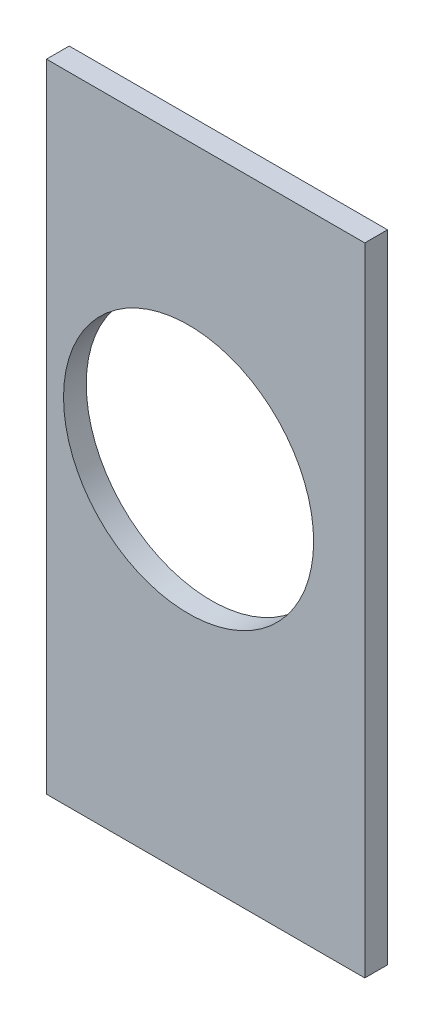
ISO-10303-21;
HEADER;
FILE_DESCRIPTION(('STEP AP214'),'2;1');
FILE_NAME('part.step','',(''),(''),'','','');
FILE_SCHEMA(('AUTOMOTIVE_DESIGN { 1 0 10303 214 1 1 1 1 }'));
ENDSEC;
DATA;
#1=APPLICATION_CONTEXT('core data for automotive mechanical design processes');
#2=APPLICATION_PROTOCOL_DEFINITION('international standard','automotive_design',2000,#1);
#3=PRODUCT_CONTEXT('',#1,'mechanical');
#4=PRODUCT('Part','Part','',(#3));
#5=PRODUCT_RELATED_PRODUCT_CATEGORY('part','',(#4));
#6=PRODUCT_DEFINITION_FORMATION('','',#4);
#7=PRODUCT_DEFINITION_CONTEXT('part definition',#1,'design');
#8=PRODUCT_DEFINITION('design','',#6,#7);
#9=PRODUCT_DEFINITION_SHAPE('','',#8);
#10=(LENGTH_UNIT() NAMED_UNIT(*) SI_UNIT(.MILLI.,.METRE.));
#11=(NAMED_UNIT(*) PLANE_ANGLE_UNIT() SI_UNIT($,.RADIAN.));
#12=(NAMED_UNIT(*) SI_UNIT($,.STERADIAN.) SOLID_ANGLE_UNIT());
#13=UNCERTAINTY_MEASURE_WITH_UNIT(LENGTH_MEASURE(1.E-05),#10,'distance_accuracy_value','');
#14=(GEOMETRIC_REPRESENTATION_CONTEXT(3) GLOBAL_UNCERTAINTY_ASSIGNED_CONTEXT((#13)) GLOBAL_UNIT_ASSIGNED_CONTEXT((#10,
#11,#12)) REPRESENTATION_CONTEXT('',''));
#15=CARTESIAN_POINT('',(0.,0.,0.));
#16=DIRECTION('',(0.,0.,1.));
#17=DIRECTION('',(1.,0.,0.));
#18=AXIS2_PLACEMENT_3D('',#15,#16,#17);
#19=CARTESIAN_POINT('',(0.,0.,10.));
#20=DIRECTION('',(1.,0.,0.));
#21=DIRECTION('',(0.,0.,-1.));
#22=AXIS2_PLACEMENT_3D('',#19,#20,#21);
#23=PLANE('',#22);
#24=DIRECTION('',(0.,-1.,0.));
#25=VECTOR('',#24,1.);
#26=CARTESIAN_POINT('',(0.,0.,0.));
#27=LINE('',#26,#25);
#28=CARTESIAN_POINT('',(0.,280.,0.));
#29=VERTEX_POINT('',#28);
#30=CARTESIAN_POINT('',(0.,0.,0.));
#31=VERTEX_POINT('',#30);
#32=EDGE_CURVE('E96',#29,#31,#27,.T.);
#33=ORIENTED_EDGE('',*,*,#32,.T.);
#34=DIRECTION('',(0.,0.,-1.));
#35=VECTOR('',#34,1.);
#36=CARTESIAN_POINT('',(0.,0.,10.));
#37=LINE('',#36,#35);
#38=CARTESIAN_POINT('',(0.,0.,10.));
#39=VERTEX_POINT('',#38);
#40=EDGE_CURVE('E11',#39,#31,#37,.T.);
#41=ORIENTED_EDGE('',*,*,#40,.F.);
#42=DIRECTION('',(0.,-1.,0.));
#43=VECTOR('',#42,1.);
#44=CARTESIAN_POINT('',(0.,0.,10.));
#45=LINE('',#44,#43);
#46=CARTESIAN_POINT('',(0.,280.,10.));
#47=VERTEX_POINT('',#46);
#48=EDGE_CURVE('E84',#47,#39,#45,.T.);
#49=ORIENTED_EDGE('',*,*,#48,.F.);
#50=DIRECTION('',(0.,0.,-1.));
#51=VECTOR('',#50,1.);
#52=CARTESIAN_POINT('',(0.,280.,10.));
#53=LINE('',#52,#51);
#54=EDGE_CURVE('E92',#47,#29,#53,.T.);
#55=ORIENTED_EDGE('',*,*,#54,.T.);
#56=EDGE_LOOP('',(#33,#41,#49,#55));
#57=FACE_BOUND('',#56,.T.);
#58=ADVANCED_FACE('F33',(#57),#23,.F.);
#59=CARTESIAN_POINT('',(0.,0.,10.));
#60=DIRECTION('',(0.,1.,0.));
#61=DIRECTION('',(0.,0.,1.));
#62=AXIS2_PLACEMENT_3D('',#59,#60,#61);
#63=PLANE('',#62);
#64=DIRECTION('',(1.,0.,0.));
#65=VECTOR('',#64,1.);
#66=CARTESIAN_POINT('',(0.,0.,0.));
#67=LINE('',#66,#65);
#68=CARTESIAN_POINT('',(140.,0.,0.));
#69=VERTEX_POINT('',#68);
#70=EDGE_CURVE('E88',#31,#69,#67,.T.);
#71=ORIENTED_EDGE('',*,*,#70,.T.);
#72=DIRECTION('',(0.,0.,-1.));
#73=VECTOR('',#72,1.);
#74=CARTESIAN_POINT('',(140.,0.,10.));
#75=LINE('',#74,#73);
#76=CARTESIAN_POINT('',(140.,0.,10.));
#77=VERTEX_POINT('',#76);
#78=EDGE_CURVE('E41',#77,#69,#75,.T.);
#79=ORIENTED_EDGE('',*,*,#78,.F.);
#80=DIRECTION('',(1.,0.,0.));
#81=VECTOR('',#80,1.);
#82=CARTESIAN_POINT('',(0.,0.,10.));
#83=LINE('',#82,#81);
#84=EDGE_CURVE('E79',#39,#77,#83,.T.);
#85=ORIENTED_EDGE('',*,*,#84,.F.);
#86=ORIENTED_EDGE('',*,*,#40,.T.);
#87=EDGE_LOOP('',(#71,#79,#85,#86));
#88=FACE_BOUND('',#87,.T.);
#89=ADVANCED_FACE('F87',(#88),#63,.F.);
#90=CARTESIAN_POINT('',(140.,0.,10.));
#91=DIRECTION('',(-1.,0.,0.));
#92=DIRECTION('',(0.,0.,1.));
#93=AXIS2_PLACEMENT_3D('',#90,#91,#92);
#94=PLANE('',#93);
#95=DIRECTION('',(0.,1.,0.));
#96=VECTOR('',#95,1.);
#97=CARTESIAN_POINT('',(140.,0.,0.));
#98=LINE('',#97,#96);
#99=CARTESIAN_POINT('',(140.,280.,0.));
#100=VERTEX_POINT('',#99);
#101=EDGE_CURVE('E66',#69,#100,#98,.T.);
#102=ORIENTED_EDGE('',*,*,#101,.T.);
#103=DIRECTION('',(0.,0.,-1.));
#104=VECTOR('',#103,1.);
#105=CARTESIAN_POINT('',(140.,280.,10.));
#106=LINE('',#105,#104);
#107=CARTESIAN_POINT('',(140.,280.,10.));
#108=VERTEX_POINT('',#107);
#109=EDGE_CURVE('E89',#108,#100,#106,.T.);
#110=ORIENTED_EDGE('',*,*,#109,.F.);
#111=DIRECTION('',(0.,1.,0.));
#112=VECTOR('',#111,1.);
#113=CARTESIAN_POINT('',(140.,0.,10.));
#114=LINE('',#113,#112);
#115=EDGE_CURVE('E82',#77,#108,#114,.T.);
#116=ORIENTED_EDGE('',*,*,#115,.F.);
#117=ORIENTED_EDGE('',*,*,#78,.T.);
#118=EDGE_LOOP('',(#102,#110,#116,#117));
#119=FACE_BOUND('',#118,.T.);
#120=ADVANCED_FACE('F90',(#119),#94,.F.);
#121=CARTESIAN_POINT('',(0.,280.,10.));
#122=DIRECTION('',(0.,-1.,0.));
#123=DIRECTION('',(0.,0.,-1.));
#124=AXIS2_PLACEMENT_3D('',#121,#122,#123);
#125=PLANE('',#124);
#126=DIRECTION('',(-1.,0.,0.));
#127=VECTOR('',#126,1.);
#128=CARTESIAN_POINT('',(0.,280.,0.));
#129=LINE('',#128,#127);
#130=EDGE_CURVE('E72',#100,#29,#129,.T.);
#131=ORIENTED_EDGE('',*,*,#130,.T.);
#132=ORIENTED_EDGE('',*,*,#54,.F.);
#133=DIRECTION('',(-1.,0.,0.));
#134=VECTOR('',#133,1.);
#135=CARTESIAN_POINT('',(0.,280.,10.));
#136=LINE('',#135,#134);
#137=EDGE_CURVE('E49',#108,#47,#136,.T.);
#138=ORIENTED_EDGE('',*,*,#137,.F.);
#139=ORIENTED_EDGE('',*,*,#109,.T.);
#140=EDGE_LOOP('',(#131,#132,#138,#139));
#141=FACE_BOUND('',#140,.T.);
#142=ADVANCED_FACE('F104',(#141),#125,.F.);
#143=CARTESIAN_POINT('',(0.,0.,10.));
#144=DIRECTION('',(0.,0.,-1.));
#145=DIRECTION('',(-1.,0.,0.));
#146=AXIS2_PLACEMENT_3D('',#143,#144,#145);
#147=PLANE('',#146);
#148=CARTESIAN_POINT('',(62.5,155.,10.));
#149=DIRECTION('',(0.,0.,-1.));
#150=DIRECTION('',(-1.,0.,0.));
#151=AXIS2_PLACEMENT_3D('',#148,#149,#150);
#152=CIRCLE('',#151,55.);
#153=CARTESIAN_POINT('',(7.49999999999999,155.,10.));
#154=VERTEX_POINT('',#153);
#155=EDGE_CURVE('E99',#154,#154,#152,.T.);
#156=ORIENTED_EDGE('',*,*,#155,.T.);
#157=EDGE_LOOP('',(#156));
#158=FACE_BOUND('',#157,.T.);
#159=ORIENTED_EDGE('',*,*,#48,.T.);
#160=ORIENTED_EDGE('',*,*,#84,.T.);
#161=ORIENTED_EDGE('',*,*,#115,.T.);
#162=ORIENTED_EDGE('',*,*,#137,.T.);
#163=EDGE_LOOP('',(#159,#160,#161,#162));
#164=FACE_BOUND('',#163,.T.);
#165=ADVANCED_FACE('F80',(#158,#164),#147,.F.);
#166=CARTESIAN_POINT('',(0.,0.,0.));
#167=DIRECTION('',(0.,0.,-1.));
#168=DIRECTION('',(-1.,0.,0.));
#169=AXIS2_PLACEMENT_3D('',#166,#167,#168);
#170=PLANE('',#169);
#171=CARTESIAN_POINT('',(62.5,155.,0.));
#172=DIRECTION('',(0.,0.,1.));
#173=DIRECTION('',(1.,0.,0.));
#174=AXIS2_PLACEMENT_3D('',#171,#172,#173);
#175=CIRCLE('',#174,55.);
#176=CARTESIAN_POINT('',(117.5,155.,0.));
#177=VERTEX_POINT('',#176);
#178=EDGE_CURVE('E112',#177,#177,#175,.T.);
#179=ORIENTED_EDGE('',*,*,#178,.T.);
#180=EDGE_LOOP('',(#179));
#181=FACE_BOUND('',#180,.T.);
#182=ORIENTED_EDGE('',*,*,#32,.F.);
#183=ORIENTED_EDGE('',*,*,#130,.F.);
#184=ORIENTED_EDGE('',*,*,#101,.F.);
#185=ORIENTED_EDGE('',*,*,#70,.F.);
#186=EDGE_LOOP('',(#182,#183,#184,#185));
#187=FACE_BOUND('',#186,.T.);
#188=ADVANCED_FACE('F107',(#181,#187),#170,.T.);
#189=CARTESIAN_POINT('',(62.5,155.,0.));
#190=DIRECTION('',(0.,0.,1.));
#191=DIRECTION('',(1.,0.,0.));
#192=AXIS2_PLACEMENT_3D('',#189,#190,#191);
#193=CYLINDRICAL_SURFACE('',#192,55.);
#194=ORIENTED_EDGE('',*,*,#178,.F.);
#195=EDGE_LOOP('',(#194));
#196=FACE_BOUND('',#195,.T.);
#197=ORIENTED_EDGE('',*,*,#155,.F.);
#198=EDGE_LOOP('',(#197));
#199=FACE_BOUND('',#198,.T.);
#200=ADVANCED_FACE('F117',(#196,#199),#193,.F.);
#201=CLOSED_SHELL('',(#58,#89,#120,#142,#165,#188,#200));
#202=MANIFOLD_SOLID_BREP('B2',#201);
#203=ADVANCED_BREP_SHAPE_REPRESENTATION('',(#18,#202),#14);
#204=SHAPE_DEFINITION_REPRESENTATION(#9,#203);
ENDSEC;
END-ISO-10303-21;
